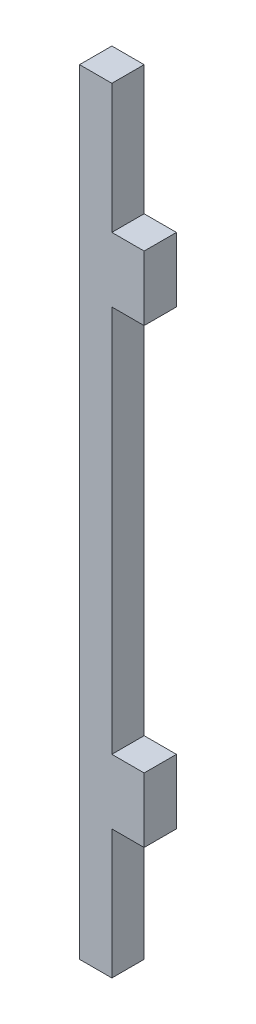
ISO-10303-21;
HEADER;
FILE_DESCRIPTION(('STEP AP214'),'2;1');
FILE_NAME('part.step','',(''),(''),'','','');
FILE_SCHEMA(('AUTOMOTIVE_DESIGN { 1 0 10303 214 1 1 1 1 }'));
ENDSEC;
DATA;
#1=APPLICATION_CONTEXT('core data for automotive mechanical design processes');
#2=APPLICATION_PROTOCOL_DEFINITION('international standard','automotive_design',2000,#1);
#3=PRODUCT_CONTEXT('',#1,'mechanical');
#4=PRODUCT('Part','Part','',(#3));
#5=PRODUCT_RELATED_PRODUCT_CATEGORY('part','',(#4));
#6=PRODUCT_DEFINITION_FORMATION('','',#4);
#7=PRODUCT_DEFINITION_CONTEXT('part definition',#1,'design');
#8=PRODUCT_DEFINITION('design','',#6,#7);
#9=PRODUCT_DEFINITION_SHAPE('','',#8);
#10=(LENGTH_UNIT() NAMED_UNIT(*) SI_UNIT(.MILLI.,.METRE.));
#11=(NAMED_UNIT(*) PLANE_ANGLE_UNIT() SI_UNIT($,.RADIAN.));
#12=(NAMED_UNIT(*) SI_UNIT($,.STERADIAN.) SOLID_ANGLE_UNIT());
#13=UNCERTAINTY_MEASURE_WITH_UNIT(LENGTH_MEASURE(1.E-05),#10,'distance_accuracy_value','');
#14=(GEOMETRIC_REPRESENTATION_CONTEXT(3) GLOBAL_UNCERTAINTY_ASSIGNED_CONTEXT((#13)) GLOBAL_UNIT_ASSIGNED_CONTEXT((#10,
#11,#12)) REPRESENTATION_CONTEXT('',''));
#15=CARTESIAN_POINT('',(0.,0.,0.));
#16=DIRECTION('',(0.,0.,1.));
#17=DIRECTION('',(1.,0.,0.));
#18=AXIS2_PLACEMENT_3D('',#15,#16,#17);
#19=CARTESIAN_POINT('',(0.,0.,5.));
#20=DIRECTION('',(-1.,0.,0.));
#21=DIRECTION('',(0.,0.,1.));
#22=AXIS2_PLACEMENT_3D('',#19,#20,#21);
#23=PLANE('',#22);
#24=DIRECTION('',(0.,1.,0.));
#25=VECTOR('',#24,1.);
#26=CARTESIAN_POINT('',(0.,0.,0.));
#27=LINE('',#26,#25);
#28=CARTESIAN_POINT('',(0.,0.,0.));
#29=VERTEX_POINT('',#28);
#30=CARTESIAN_POINT('',(0.,20.,0.));
#31=VERTEX_POINT('',#30);
#32=EDGE_CURVE('E153',#29,#31,#27,.T.);
#33=ORIENTED_EDGE('',*,*,#32,.T.);
#34=DIRECTION('',(0.,0.,-1.));
#35=VECTOR('',#34,1.);
#36=CARTESIAN_POINT('',(0.,20.,5.));
#37=LINE('',#36,#35);
#38=CARTESIAN_POINT('',(0.,20.,5.));
#39=VERTEX_POINT('',#38);
#40=EDGE_CURVE('E11',#39,#31,#37,.T.);
#41=ORIENTED_EDGE('',*,*,#40,.F.);
#42=DIRECTION('',(0.,1.,0.));
#43=VECTOR('',#42,1.);
#44=CARTESIAN_POINT('',(0.,0.,5.));
#45=LINE('',#44,#43);
#46=CARTESIAN_POINT('',(0.,0.,5.));
#47=VERTEX_POINT('',#46);
#48=EDGE_CURVE('E175',#47,#39,#45,.T.);
#49=ORIENTED_EDGE('',*,*,#48,.F.);
#50=DIRECTION('',(0.,0.,-1.));
#51=VECTOR('',#50,1.);
#52=CARTESIAN_POINT('',(0.,0.,5.));
#53=LINE('',#52,#51);
#54=EDGE_CURVE('E149',#47,#29,#53,.T.);
#55=ORIENTED_EDGE('',*,*,#54,.T.);
#56=EDGE_LOOP('',(#33,#41,#49,#55));
#57=FACE_BOUND('',#56,.T.);
#58=ADVANCED_FACE('F33',(#57),#23,.F.);
#59=CARTESIAN_POINT('',(0.,20.,5.));
#60=DIRECTION('',(0.,1.,0.));
#61=DIRECTION('',(-1.,0.,0.));
#62=AXIS2_PLACEMENT_3D('',#59,#60,#61);
#63=PLANE('',#62);
#64=DIRECTION('',(1.,0.,0.));
#65=VECTOR('',#64,1.);
#66=CARTESIAN_POINT('',(0.,20.,0.));
#67=LINE('',#66,#65);
#68=CARTESIAN_POINT('',(5.,20.,0.));
#69=VERTEX_POINT('',#68);
#70=EDGE_CURVE('E156',#31,#69,#67,.T.);
#71=ORIENTED_EDGE('',*,*,#70,.T.);
#72=DIRECTION('',(0.,0.,-1.));
#73=VECTOR('',#72,1.);
#74=CARTESIAN_POINT('',(5.,20.,5.));
#75=LINE('',#74,#73);
#76=CARTESIAN_POINT('',(5.,20.,5.));
#77=VERTEX_POINT('',#76);
#78=EDGE_CURVE('E41',#77,#69,#75,.T.);
#79=ORIENTED_EDGE('',*,*,#78,.F.);
#80=DIRECTION('',(1.,0.,0.));
#81=VECTOR('',#80,1.);
#82=CARTESIAN_POINT('',(0.,20.,5.));
#83=LINE('',#82,#81);
#84=EDGE_CURVE('E104',#39,#77,#83,.T.);
#85=ORIENTED_EDGE('',*,*,#84,.F.);
#86=ORIENTED_EDGE('',*,*,#40,.T.);
#87=EDGE_LOOP('',(#71,#79,#85,#86));
#88=FACE_BOUND('',#87,.T.);
#89=ADVANCED_FACE('F253',(#88),#63,.F.);
#90=CARTESIAN_POINT('',(5.,20.,5.));
#91=DIRECTION('',(-1.,0.,0.));
#92=DIRECTION('',(0.,0.,1.));
#93=AXIS2_PLACEMENT_3D('',#90,#91,#92);
#94=PLANE('',#93);
#95=DIRECTION('',(0.,1.,0.));
#96=VECTOR('',#95,1.);
#97=CARTESIAN_POINT('',(5.,20.,0.));
#98=LINE('',#97,#96);
#99=CARTESIAN_POINT('',(5.,30.,0.));
#100=VERTEX_POINT('',#99);
#101=EDGE_CURVE('E158',#69,#100,#98,.T.);
#102=ORIENTED_EDGE('',*,*,#101,.T.);
#103=DIRECTION('',(0.,0.,-1.));
#104=VECTOR('',#103,1.);
#105=CARTESIAN_POINT('',(5.,30.,5.));
#106=LINE('',#105,#104);
#107=CARTESIAN_POINT('',(5.,30.,5.));
#108=VERTEX_POINT('',#107);
#109=EDGE_CURVE('E194',#108,#100,#106,.T.);
#110=ORIENTED_EDGE('',*,*,#109,.F.);
#111=DIRECTION('',(0.,1.,0.));
#112=VECTOR('',#111,1.);
#113=CARTESIAN_POINT('',(5.,20.,5.));
#114=LINE('',#113,#112);
#115=EDGE_CURVE('E202',#77,#108,#114,.T.);
#116=ORIENTED_EDGE('',*,*,#115,.F.);
#117=ORIENTED_EDGE('',*,*,#78,.T.);
#118=EDGE_LOOP('',(#102,#110,#116,#117));
#119=FACE_BOUND('',#118,.T.);
#120=ADVANCED_FACE('F200',(#119),#94,.F.);
#121=CARTESIAN_POINT('',(0.,30.,5.));
#122=DIRECTION('',(0.,-1.,0.));
#123=DIRECTION('',(0.,0.,-1.));
#124=AXIS2_PLACEMENT_3D('',#121,#122,#123);
#125=PLANE('',#124);
#126=DIRECTION('',(-1.,0.,0.));
#127=VECTOR('',#126,1.);
#128=CARTESIAN_POINT('',(0.,30.,0.));
#129=LINE('',#128,#127);
#130=CARTESIAN_POINT('',(0.,30.,0.));
#131=VERTEX_POINT('',#130);
#132=EDGE_CURVE('E160',#100,#131,#129,.T.);
#133=ORIENTED_EDGE('',*,*,#132,.T.);
#134=DIRECTION('',(0.,0.,-1.));
#135=VECTOR('',#134,1.);
#136=CARTESIAN_POINT('',(0.,30.,5.));
#137=LINE('',#136,#135);
#138=CARTESIAN_POINT('',(0.,30.,5.));
#139=VERTEX_POINT('',#138);
#140=EDGE_CURVE('E191',#139,#131,#137,.T.);
#141=ORIENTED_EDGE('',*,*,#140,.F.);
#142=DIRECTION('',(-1.,0.,0.));
#143=VECTOR('',#142,1.);
#144=CARTESIAN_POINT('',(0.,30.,5.));
#145=LINE('',#144,#143);
#146=EDGE_CURVE('E220',#108,#139,#145,.T.);
#147=ORIENTED_EDGE('',*,*,#146,.F.);
#148=ORIENTED_EDGE('',*,*,#109,.T.);
#149=EDGE_LOOP('',(#133,#141,#147,#148));
#150=FACE_BOUND('',#149,.T.);
#151=ADVANCED_FACE('F211',(#150),#125,.F.);
#152=CARTESIAN_POINT('',(0.,30.,5.));
#153=DIRECTION('',(-1.,0.,0.));
#154=DIRECTION('',(0.,0.,1.));
#155=AXIS2_PLACEMENT_3D('',#152,#153,#154);
#156=PLANE('',#155);
#157=DIRECTION('',(0.,1.,0.));
#158=VECTOR('',#157,1.);
#159=CARTESIAN_POINT('',(0.,30.,0.));
#160=LINE('',#159,#158);
#161=CARTESIAN_POINT('',(0.,90.,0.));
#162=VERTEX_POINT('',#161);
#163=EDGE_CURVE('E162',#131,#162,#160,.T.);
#164=ORIENTED_EDGE('',*,*,#163,.T.);
#165=DIRECTION('',(0.,0.,-1.));
#166=VECTOR('',#165,1.);
#167=CARTESIAN_POINT('',(0.,90.,5.));
#168=LINE('',#167,#166);
#169=CARTESIAN_POINT('',(0.,90.,5.));
#170=VERTEX_POINT('',#169);
#171=EDGE_CURVE('E188',#170,#162,#168,.T.);
#172=ORIENTED_EDGE('',*,*,#171,.F.);
#173=DIRECTION('',(0.,1.,0.));
#174=VECTOR('',#173,1.);
#175=CARTESIAN_POINT('',(0.,30.,5.));
#176=LINE('',#175,#174);
#177=EDGE_CURVE('E217',#139,#170,#176,.T.);
#178=ORIENTED_EDGE('',*,*,#177,.F.);
#179=ORIENTED_EDGE('',*,*,#140,.T.);
#180=EDGE_LOOP('',(#164,#172,#178,#179));
#181=FACE_BOUND('',#180,.T.);
#182=ADVANCED_FACE('F215',(#181),#156,.F.);
#183=CARTESIAN_POINT('',(0.,90.,5.));
#184=DIRECTION('',(0.,1.,0.));
#185=DIRECTION('',(0.,0.,1.));
#186=AXIS2_PLACEMENT_3D('',#183,#184,#185);
#187=PLANE('',#186);
#188=DIRECTION('',(1.,0.,0.));
#189=VECTOR('',#188,1.);
#190=CARTESIAN_POINT('',(0.,90.,0.));
#191=LINE('',#190,#189);
#192=CARTESIAN_POINT('',(5.,90.,0.));
#193=VERTEX_POINT('',#192);
#194=EDGE_CURVE('E164',#162,#193,#191,.T.);
#195=ORIENTED_EDGE('',*,*,#194,.T.);
#196=DIRECTION('',(0.,0.,-1.));
#197=VECTOR('',#196,1.);
#198=CARTESIAN_POINT('',(5.,90.,5.));
#199=LINE('',#198,#197);
#200=CARTESIAN_POINT('',(5.,90.,5.));
#201=VERTEX_POINT('',#200);
#202=EDGE_CURVE('E185',#201,#193,#199,.T.);
#203=ORIENTED_EDGE('',*,*,#202,.F.);
#204=DIRECTION('',(1.,0.,0.));
#205=VECTOR('',#204,1.);
#206=CARTESIAN_POINT('',(0.,90.,5.));
#207=LINE('',#206,#205);
#208=EDGE_CURVE('E219',#170,#201,#207,.T.);
#209=ORIENTED_EDGE('',*,*,#208,.F.);
#210=ORIENTED_EDGE('',*,*,#171,.T.);
#211=EDGE_LOOP('',(#195,#203,#209,#210));
#212=FACE_BOUND('',#211,.T.);
#213=ADVANCED_FACE('F266',(#212),#187,.F.);
#214=CARTESIAN_POINT('',(5.,100.,5.));
#215=DIRECTION('',(-1.,0.,0.));
#216=DIRECTION('',(0.,0.,1.));
#217=AXIS2_PLACEMENT_3D('',#214,#215,#216);
#218=PLANE('',#217);
#219=DIRECTION('',(0.,1.,0.));
#220=VECTOR('',#219,1.);
#221=CARTESIAN_POINT('',(5.,100.,0.));
#222=LINE('',#221,#220);
#223=CARTESIAN_POINT('',(5.,100.,0.));
#224=VERTEX_POINT('',#223);
#225=EDGE_CURVE('E166',#193,#224,#222,.T.);
#226=ORIENTED_EDGE('',*,*,#225,.T.);
#227=DIRECTION('',(0.,0.,-1.));
#228=VECTOR('',#227,1.);
#229=CARTESIAN_POINT('',(5.,100.,5.));
#230=LINE('',#229,#228);
#231=CARTESIAN_POINT('',(5.,100.,5.));
#232=VERTEX_POINT('',#231);
#233=EDGE_CURVE('E182',#232,#224,#230,.T.);
#234=ORIENTED_EDGE('',*,*,#233,.F.);
#235=DIRECTION('',(0.,1.,0.));
#236=VECTOR('',#235,1.);
#237=CARTESIAN_POINT('',(5.,100.,5.));
#238=LINE('',#237,#236);
#239=EDGE_CURVE('E222',#201,#232,#238,.T.);
#240=ORIENTED_EDGE('',*,*,#239,.F.);
#241=ORIENTED_EDGE('',*,*,#202,.T.);
#242=EDGE_LOOP('',(#226,#234,#240,#241));
#243=FACE_BOUND('',#242,.T.);
#244=ADVANCED_FACE('F269',(#243),#218,.F.);
#245=CARTESIAN_POINT('',(0.,100.,5.));
#246=DIRECTION('',(0.,-1.,0.));
#247=DIRECTION('',(0.,0.,-1.));
#248=AXIS2_PLACEMENT_3D('',#245,#246,#247);
#249=PLANE('',#248);
#250=DIRECTION('',(-1.,0.,0.));
#251=VECTOR('',#250,1.);
#252=CARTESIAN_POINT('',(0.,100.,0.));
#253=LINE('',#252,#251);
#254=CARTESIAN_POINT('',(0.,100.,0.));
#255=VERTEX_POINT('',#254);
#256=EDGE_CURVE('E168',#224,#255,#253,.T.);
#257=ORIENTED_EDGE('',*,*,#256,.T.);
#258=DIRECTION('',(0.,0.,-1.));
#259=VECTOR('',#258,1.);
#260=CARTESIAN_POINT('',(0.,100.,5.));
#261=LINE('',#260,#259);
#262=CARTESIAN_POINT('',(0.,100.,5.));
#263=VERTEX_POINT('',#262);
#264=EDGE_CURVE('E179',#263,#255,#261,.T.);
#265=ORIENTED_EDGE('',*,*,#264,.F.);
#266=DIRECTION('',(-1.,0.,0.));
#267=VECTOR('',#266,1.);
#268=CARTESIAN_POINT('',(0.,100.,5.));
#269=LINE('',#268,#267);
#270=EDGE_CURVE('E228',#232,#263,#269,.T.);
#271=ORIENTED_EDGE('',*,*,#270,.F.);
#272=ORIENTED_EDGE('',*,*,#233,.T.);
#273=EDGE_LOOP('',(#257,#265,#271,#272));
#274=FACE_BOUND('',#273,.T.);
#275=ADVANCED_FACE('F234',(#274),#249,.F.);
#276=CARTESIAN_POINT('',(0.,100.,5.));
#277=DIRECTION('',(-1.,0.,0.));
#278=DIRECTION('',(0.,0.,1.));
#279=AXIS2_PLACEMENT_3D('',#276,#277,#278);
#280=PLANE('',#279);
#281=DIRECTION('',(0.,1.,0.));
#282=VECTOR('',#281,1.);
#283=CARTESIAN_POINT('',(0.,100.,0.));
#284=LINE('',#283,#282);
#285=CARTESIAN_POINT('',(0.,120.,0.));
#286=VERTEX_POINT('',#285);
#287=EDGE_CURVE('E170',#255,#286,#284,.T.);
#288=ORIENTED_EDGE('',*,*,#287,.T.);
#289=DIRECTION('',(0.,0.,-1.));
#290=VECTOR('',#289,1.);
#291=CARTESIAN_POINT('',(0.,120.,5.));
#292=LINE('',#291,#290);
#293=CARTESIAN_POINT('',(0.,120.,5.));
#294=VERTEX_POINT('',#293);
#295=EDGE_CURVE('E144',#294,#286,#292,.T.);
#296=ORIENTED_EDGE('',*,*,#295,.F.);
#297=DIRECTION('',(0.,1.,0.));
#298=VECTOR('',#297,1.);
#299=CARTESIAN_POINT('',(0.,100.,5.));
#300=LINE('',#299,#298);
#301=EDGE_CURVE('E135',#263,#294,#300,.T.);
#302=ORIENTED_EDGE('',*,*,#301,.F.);
#303=ORIENTED_EDGE('',*,*,#264,.T.);
#304=EDGE_LOOP('',(#288,#296,#302,#303));
#305=FACE_BOUND('',#304,.T.);
#306=ADVANCED_FACE('F238',(#305),#280,.F.);
#307=CARTESIAN_POINT('',(0.,120.,5.));
#308=DIRECTION('',(0.,-1.,0.));
#309=DIRECTION('',(0.,0.,-1.));
#310=AXIS2_PLACEMENT_3D('',#307,#308,#309);
#311=PLANE('',#310);
#312=DIRECTION('',(-1.,0.,0.));
#313=VECTOR('',#312,1.);
#314=CARTESIAN_POINT('',(0.,120.,0.));
#315=LINE('',#314,#313);
#316=CARTESIAN_POINT('',(-4.99999999999999,120.,0.));
#317=VERTEX_POINT('',#316);
#318=EDGE_CURVE('E143',#286,#317,#315,.T.);
#319=ORIENTED_EDGE('',*,*,#318,.T.);
#320=DIRECTION('',(0.,0.,-1.));
#321=VECTOR('',#320,1.);
#322=CARTESIAN_POINT('',(-4.99999999999999,120.,5.));
#323=LINE('',#322,#321);
#324=CARTESIAN_POINT('',(-4.99999999999999,120.,5.));
#325=VERTEX_POINT('',#324);
#326=EDGE_CURVE('E140',#325,#317,#323,.T.);
#327=ORIENTED_EDGE('',*,*,#326,.F.);
#328=DIRECTION('',(-1.,0.,0.));
#329=VECTOR('',#328,1.);
#330=CARTESIAN_POINT('',(0.,120.,5.));
#331=LINE('',#330,#329);
#332=EDGE_CURVE('E129',#294,#325,#331,.T.);
#333=ORIENTED_EDGE('',*,*,#332,.F.);
#334=ORIENTED_EDGE('',*,*,#295,.T.);
#335=EDGE_LOOP('',(#319,#327,#333,#334));
#336=FACE_BOUND('',#335,.T.);
#337=ADVANCED_FACE('F141',(#336),#311,.F.);
#338=CARTESIAN_POINT('',(-5.,0.,5.));
#339=DIRECTION('',(1.,0.,0.));
#340=DIRECTION('',(0.,1.,0.));
#341=AXIS2_PLACEMENT_3D('',#338,#339,#340);
#342=PLANE('',#341);
#343=DIRECTION('',(0.,-1.,0.));
#344=VECTOR('',#343,1.);
#345=CARTESIAN_POINT('',(-5.,0.,0.));
#346=LINE('',#345,#344);
#347=CARTESIAN_POINT('',(-5.,0.,0.));
#348=VERTEX_POINT('',#347);
#349=EDGE_CURVE('E90',#317,#348,#346,.T.);
#350=ORIENTED_EDGE('',*,*,#349,.T.);
#351=DIRECTION('',(0.,0.,-1.));
#352=VECTOR('',#351,1.);
#353=CARTESIAN_POINT('',(-5.,0.,5.));
#354=LINE('',#353,#352);
#355=CARTESIAN_POINT('',(-5.,0.,5.));
#356=VERTEX_POINT('',#355);
#357=EDGE_CURVE('E145',#356,#348,#354,.T.);
#358=ORIENTED_EDGE('',*,*,#357,.F.);
#359=DIRECTION('',(0.,-1.,0.));
#360=VECTOR('',#359,1.);
#361=CARTESIAN_POINT('',(-5.,0.,5.));
#362=LINE('',#361,#360);
#363=EDGE_CURVE('E133',#325,#356,#362,.T.);
#364=ORIENTED_EDGE('',*,*,#363,.F.);
#365=ORIENTED_EDGE('',*,*,#326,.T.);
#366=EDGE_LOOP('',(#350,#358,#364,#365));
#367=FACE_BOUND('',#366,.T.);
#368=ADVANCED_FACE('F147',(#367),#342,.F.);
#369=CARTESIAN_POINT('',(0.,0.,5.));
#370=DIRECTION('',(0.,1.,0.));
#371=DIRECTION('',(-1.,0.,0.));
#372=AXIS2_PLACEMENT_3D('',#369,#370,#371);
#373=PLANE('',#372);
#374=DIRECTION('',(1.,0.,0.));
#375=VECTOR('',#374,1.);
#376=CARTESIAN_POINT('',(0.,0.,0.));
#377=LINE('',#376,#375);
#378=EDGE_CURVE('E96',#348,#29,#377,.T.);
#379=ORIENTED_EDGE('',*,*,#378,.T.);
#380=ORIENTED_EDGE('',*,*,#54,.F.);
#381=DIRECTION('',(1.,0.,0.));
#382=VECTOR('',#381,1.);
#383=CARTESIAN_POINT('',(0.,0.,5.));
#384=LINE('',#383,#382);
#385=EDGE_CURVE('E49',#356,#47,#384,.T.);
#386=ORIENTED_EDGE('',*,*,#385,.F.);
#387=ORIENTED_EDGE('',*,*,#357,.T.);
#388=EDGE_LOOP('',(#379,#380,#386,#387));
#389=FACE_BOUND('',#388,.T.);
#390=ADVANCED_FACE('F242',(#389),#373,.F.);
#391=CARTESIAN_POINT('',(0.,0.,5.));
#392=DIRECTION('',(0.,0.,-1.));
#393=DIRECTION('',(-1.,0.,0.));
#394=AXIS2_PLACEMENT_3D('',#391,#392,#393);
#395=PLANE('',#394);
#396=ORIENTED_EDGE('',*,*,#48,.T.);
#397=ORIENTED_EDGE('',*,*,#84,.T.);
#398=ORIENTED_EDGE('',*,*,#115,.T.);
#399=ORIENTED_EDGE('',*,*,#146,.T.);
#400=ORIENTED_EDGE('',*,*,#177,.T.);
#401=ORIENTED_EDGE('',*,*,#208,.T.);
#402=ORIENTED_EDGE('',*,*,#239,.T.);
#403=ORIENTED_EDGE('',*,*,#270,.T.);
#404=ORIENTED_EDGE('',*,*,#301,.T.);
#405=ORIENTED_EDGE('',*,*,#332,.T.);
#406=ORIENTED_EDGE('',*,*,#363,.T.);
#407=ORIENTED_EDGE('',*,*,#385,.T.);
#408=EDGE_LOOP('',(#396,#397,#398,#399,#400,#401,#402,#403,#404,#405,#406,#407));
#409=FACE_BOUND('',#408,.T.);
#410=ADVANCED_FACE('F131',(#409),#395,.F.);
#411=CARTESIAN_POINT('',(0.,0.,0.));
#412=DIRECTION('',(0.,0.,-1.));
#413=DIRECTION('',(-1.,0.,0.));
#414=AXIS2_PLACEMENT_3D('',#411,#412,#413);
#415=PLANE('',#414);
#416=ORIENTED_EDGE('',*,*,#32,.F.);
#417=ORIENTED_EDGE('',*,*,#378,.F.);
#418=ORIENTED_EDGE('',*,*,#349,.F.);
#419=ORIENTED_EDGE('',*,*,#318,.F.);
#420=ORIENTED_EDGE('',*,*,#287,.F.);
#421=ORIENTED_EDGE('',*,*,#256,.F.);
#422=ORIENTED_EDGE('',*,*,#225,.F.);
#423=ORIENTED_EDGE('',*,*,#194,.F.);
#424=ORIENTED_EDGE('',*,*,#163,.F.);
#425=ORIENTED_EDGE('',*,*,#132,.F.);
#426=ORIENTED_EDGE('',*,*,#101,.F.);
#427=ORIENTED_EDGE('',*,*,#70,.F.);
#428=EDGE_LOOP('',(#416,#417,#418,#419,#420,#421,#422,#423,#424,#425,#426,#427));
#429=FACE_BOUND('',#428,.T.);
#430=ADVANCED_FACE('F206',(#429),#415,.T.);
#431=CLOSED_SHELL('',(#58,#89,#120,#151,#182,#213,#244,#275,#306,#337,#368,#390,#410,#430));
#432=MANIFOLD_SOLID_BREP('B2',#431);
#433=ADVANCED_BREP_SHAPE_REPRESENTATION('',(#18,#432),#14);
#434=SHAPE_DEFINITION_REPRESENTATION(#9,#433);
ENDSEC;
END-ISO-10303-21;
